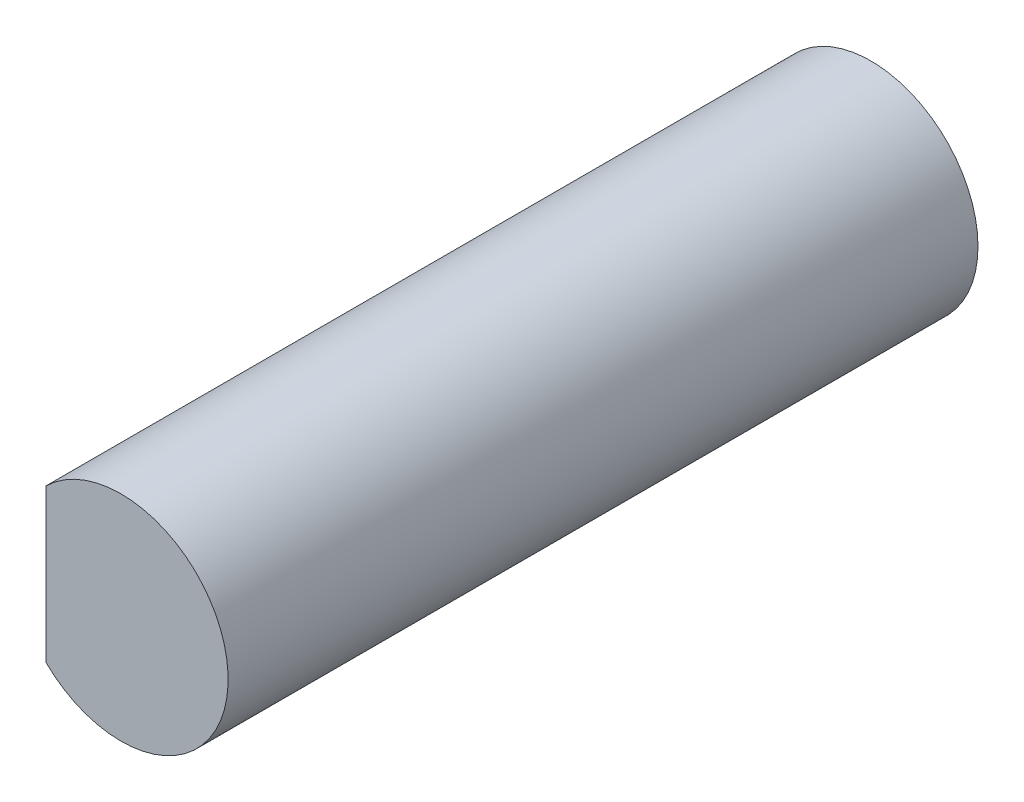
ISO-10303-21;
HEADER;
FILE_DESCRIPTION(('STEP AP214'),'2;1');
FILE_NAME('part.step','',(''),(''),'','','');
FILE_SCHEMA(('AUTOMOTIVE_DESIGN { 1 0 10303 214 1 1 1 1 }'));
ENDSEC;
DATA;
#1=APPLICATION_CONTEXT('core data for automotive mechanical design processes');
#2=APPLICATION_PROTOCOL_DEFINITION('international standard','automotive_design',2000,#1);
#3=PRODUCT_CONTEXT('',#1,'mechanical');
#4=PRODUCT('Part','Part','',(#3));
#5=PRODUCT_RELATED_PRODUCT_CATEGORY('part','',(#4));
#6=PRODUCT_DEFINITION_FORMATION('','',#4);
#7=PRODUCT_DEFINITION_CONTEXT('part definition',#1,'design');
#8=PRODUCT_DEFINITION('design','',#6,#7);
#9=PRODUCT_DEFINITION_SHAPE('','',#8);
#10=(LENGTH_UNIT() NAMED_UNIT(*) SI_UNIT(.MILLI.,.METRE.));
#11=(NAMED_UNIT(*) PLANE_ANGLE_UNIT() SI_UNIT($,.RADIAN.));
#12=(NAMED_UNIT(*) SI_UNIT($,.STERADIAN.) SOLID_ANGLE_UNIT());
#13=UNCERTAINTY_MEASURE_WITH_UNIT(LENGTH_MEASURE(1.E-05),#10,'distance_accuracy_value','');
#14=(GEOMETRIC_REPRESENTATION_CONTEXT(3) GLOBAL_UNCERTAINTY_ASSIGNED_CONTEXT((#13)) GLOBAL_UNIT_ASSIGNED_CONTEXT((#10,
#11,#12)) REPRESENTATION_CONTEXT('',''));
#15=CARTESIAN_POINT('',(0.,0.,0.));
#16=DIRECTION('',(0.,0.,1.));
#17=DIRECTION('',(1.,0.,0.));
#18=AXIS2_PLACEMENT_3D('',#15,#16,#17);
#19=CARTESIAN_POINT('',(0.,0.,25.));
#20=DIRECTION('',(0.,0.,-1.));
#21=DIRECTION('',(-1.,0.,0.));
#22=AXIS2_PLACEMENT_3D('',#19,#20,#21);
#23=CYLINDRICAL_SURFACE('',#22,5.);
#24=CARTESIAN_POINT('',(0.,0.,10.));
#25=DIRECTION('',(0.,0.,1.));
#26=DIRECTION('',(1.,0.,0.));
#27=AXIS2_PLACEMENT_3D('',#24,#25,#26);
#28=CIRCLE('',#27,5.);
#29=CARTESIAN_POINT('',(-3.5,3.57071421427143,10.));
#30=VERTEX_POINT('',#29);
#31=CARTESIAN_POINT('',(-3.5,-3.57071421427143,10.));
#32=VERTEX_POINT('',#31);
#33=EDGE_CURVE('E12',#30,#32,#28,.T.);
#34=ORIENTED_EDGE('',*,*,#33,.F.);
#35=DIRECTION('',(0.,0.,1.));
#36=VECTOR('',#35,1.);
#37=CARTESIAN_POINT('',(-3.5,3.57071421427143,10.));
#38=LINE('',#37,#36);
#39=CARTESIAN_POINT('',(-3.5,3.57071421427143,25.));
#40=VERTEX_POINT('',#39);
#41=EDGE_CURVE('E71',#30,#40,#38,.T.);
#42=ORIENTED_EDGE('',*,*,#41,.T.);
#43=CARTESIAN_POINT('',(0.,0.,25.));
#44=DIRECTION('',(0.,0.,1.));
#45=DIRECTION('',(1.,0.,0.));
#46=AXIS2_PLACEMENT_3D('',#43,#44,#45);
#47=CIRCLE('',#46,5.);
#48=CARTESIAN_POINT('',(-3.5,-3.57071421427143,25.));
#49=VERTEX_POINT('',#48);
#50=EDGE_CURVE('E53',#49,#40,#47,.T.);
#51=ORIENTED_EDGE('',*,*,#50,.F.);
#52=DIRECTION('',(0.,0.,1.));
#53=VECTOR('',#52,1.);
#54=CARTESIAN_POINT('',(-3.5,-3.57071421427143,10.));
#55=LINE('',#54,#53);
#56=EDGE_CURVE('E60',#32,#49,#55,.T.);
#57=ORIENTED_EDGE('',*,*,#56,.F.);
#58=EDGE_LOOP('',(#34,#42,#51,#57));
#59=FACE_BOUND('',#58,.T.);
#60=CARTESIAN_POINT('',(0.,0.,-10.));
#61=DIRECTION('',(0.,0.,-1.));
#62=DIRECTION('',(-1.,0.,0.));
#63=AXIS2_PLACEMENT_3D('',#60,#61,#62);
#64=CIRCLE('',#63,5.);
#65=CARTESIAN_POINT('',(-5.,0.,-10.));
#66=VERTEX_POINT('',#65);
#67=EDGE_CURVE('E89',#66,#66,#64,.T.);
#68=ORIENTED_EDGE('',*,*,#67,.F.);
#69=EDGE_LOOP('',(#68));
#70=FACE_BOUND('',#69,.T.);
#71=ADVANCED_FACE('F45',(#59,#70),#23,.T.);
#72=CARTESIAN_POINT('',(0.,0.,25.));
#73=DIRECTION('',(0.,0.,1.));
#74=DIRECTION('',(1.,0.,0.));
#75=AXIS2_PLACEMENT_3D('',#72,#73,#74);
#76=PLANE('',#75);
#77=ORIENTED_EDGE('',*,*,#50,.T.);
#78=DIRECTION('',(0.,-1.,0.));
#79=VECTOR('',#78,1.);
#80=CARTESIAN_POINT('',(-3.5,3.57071421427143,25.));
#81=LINE('',#80,#79);
#82=EDGE_CURVE('E74',#40,#49,#81,.T.);
#83=ORIENTED_EDGE('',*,*,#82,.T.);
#84=EDGE_LOOP('',(#77,#83));
#85=FACE_BOUND('',#84,.T.);
#86=ADVANCED_FACE('F97',(#85),#76,.T.);
#87=CARTESIAN_POINT('',(0.,0.,10.));
#88=DIRECTION('',(0.,0.,1.));
#89=DIRECTION('',(1.,0.,0.));
#90=AXIS2_PLACEMENT_3D('',#87,#88,#89);
#91=PLANE('',#90);
#92=ORIENTED_EDGE('',*,*,#33,.T.);
#93=DIRECTION('',(0.,-1.,0.));
#94=VECTOR('',#93,1.);
#95=CARTESIAN_POINT('',(-3.5,3.57071421427143,10.));
#96=LINE('',#95,#94);
#97=EDGE_CURVE('E73',#30,#32,#96,.T.);
#98=ORIENTED_EDGE('',*,*,#97,.F.);
#99=EDGE_LOOP('',(#92,#98));
#100=FACE_BOUND('',#99,.T.);
#101=ADVANCED_FACE('F80',(#100),#91,.T.);
#102=CARTESIAN_POINT('',(-3.5,3.57071421427143,10.));
#103=DIRECTION('',(-1.,0.,0.));
#104=DIRECTION('',(0.,0.,1.));
#105=AXIS2_PLACEMENT_3D('',#102,#103,#104);
#106=PLANE('',#105);
#107=ORIENTED_EDGE('',*,*,#82,.F.);
#108=ORIENTED_EDGE('',*,*,#41,.F.);
#109=ORIENTED_EDGE('',*,*,#97,.T.);
#110=ORIENTED_EDGE('',*,*,#56,.T.);
#111=EDGE_LOOP('',(#107,#108,#109,#110));
#112=FACE_BOUND('',#111,.T.);
#113=ADVANCED_FACE('F72',(#112),#106,.T.);
#114=CARTESIAN_POINT('',(0.,0.,-10.));
#115=DIRECTION('',(0.,0.,-1.));
#116=DIRECTION('',(-1.,0.,0.));
#117=AXIS2_PLACEMENT_3D('',#114,#115,#116);
#118=PLANE('',#117);
#119=ORIENTED_EDGE('',*,*,#67,.T.);
#120=EDGE_LOOP('',(#119));
#121=FACE_BOUND('',#120,.T.);
#122=ADVANCED_FACE('F95',(#121),#118,.T.);
#123=CLOSED_SHELL('',(#71,#86,#101,#113,#122));
#124=MANIFOLD_SOLID_BREP('B2',#123);
#125=ADVANCED_BREP_SHAPE_REPRESENTATION('',(#18,#124),#14);
#126=SHAPE_DEFINITION_REPRESENTATION(#9,#125);
ENDSEC;
END-ISO-10303-21;
